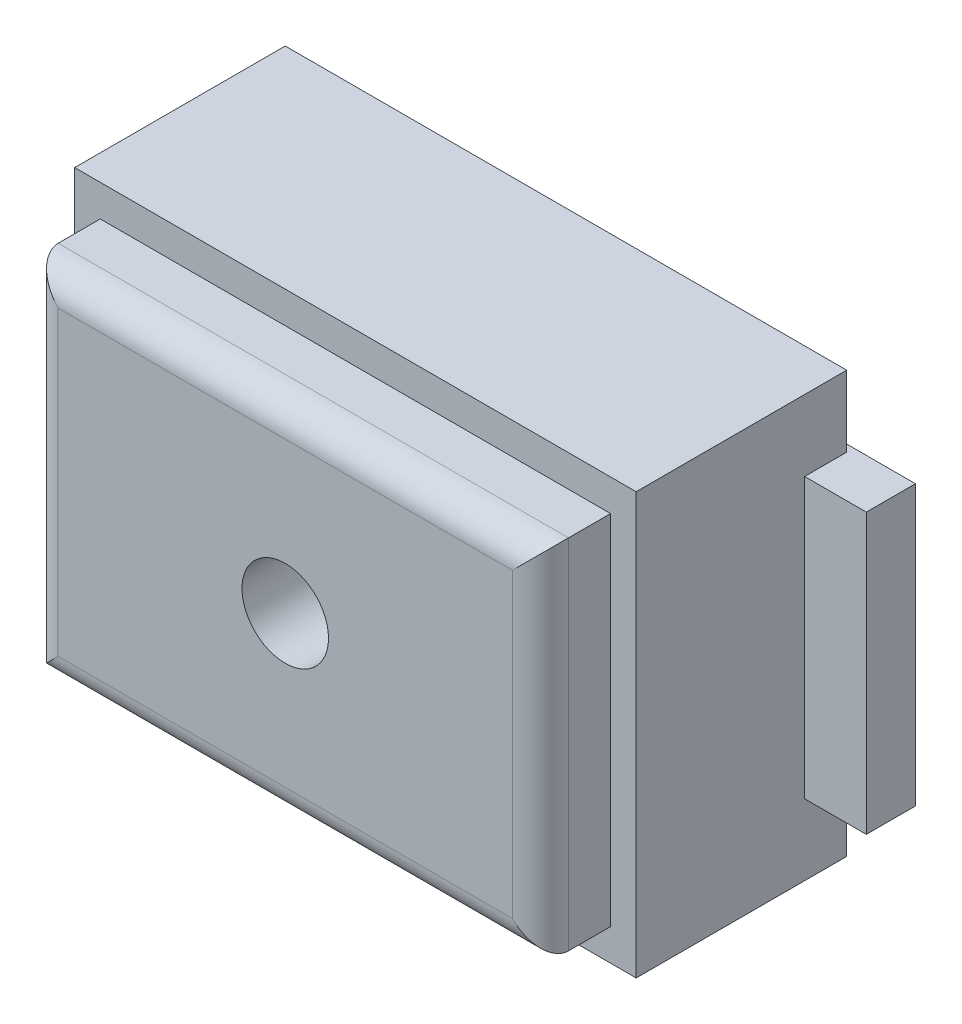
ISO-10303-21;
HEADER;
FILE_DESCRIPTION(('STEP AP214'),'2;1');
FILE_NAME('part.step','',(''),(''),'','','');
FILE_SCHEMA(('AUTOMOTIVE_DESIGN { 1 0 10303 214 1 1 1 1 }'));
ENDSEC;
DATA;
#1=APPLICATION_CONTEXT('core data for automotive mechanical design processes');
#2=APPLICATION_PROTOCOL_DEFINITION('international standard','automotive_design',2000,#1);
#3=PRODUCT_CONTEXT('',#1,'mechanical');
#4=PRODUCT('Part','Part','',(#3));
#5=PRODUCT_RELATED_PRODUCT_CATEGORY('part','',(#4));
#6=PRODUCT_DEFINITION_FORMATION('','',#4);
#7=PRODUCT_DEFINITION_CONTEXT('part definition',#1,'design');
#8=PRODUCT_DEFINITION('design','',#6,#7);
#9=PRODUCT_DEFINITION_SHAPE('','',#8);
#10=(LENGTH_UNIT() NAMED_UNIT(*) SI_UNIT(.MILLI.,.METRE.));
#11=(NAMED_UNIT(*) PLANE_ANGLE_UNIT() SI_UNIT($,.RADIAN.));
#12=(NAMED_UNIT(*) SI_UNIT($,.STERADIAN.) SOLID_ANGLE_UNIT());
#13=UNCERTAINTY_MEASURE_WITH_UNIT(LENGTH_MEASURE(1.E-05),#10,'distance_accuracy_value','');
#14=(GEOMETRIC_REPRESENTATION_CONTEXT(3) GLOBAL_UNCERTAINTY_ASSIGNED_CONTEXT((#13)) GLOBAL_UNIT_ASSIGNED_CONTEXT((#10,
#11,#12)) REPRESENTATION_CONTEXT('',''));
#15=CARTESIAN_POINT('',(0.,0.,0.));
#16=DIRECTION('',(0.,0.,1.));
#17=DIRECTION('',(1.,0.,0.));
#18=AXIS2_PLACEMENT_3D('',#15,#16,#17);
#19=CARTESIAN_POINT('',(0.,0.,1.5));
#20=DIRECTION('',(0.,0.,-1.));
#21=DIRECTION('',(-1.,0.,0.));
#22=AXIS2_PLACEMENT_3D('',#19,#20,#21);
#23=PLANE('',#22);
#24=CARTESIAN_POINT('',(0.,0.,1.5));
#25=DIRECTION('',(0.,0.,1.));
#26=DIRECTION('',(1.,0.,0.));
#27=AXIS2_PLACEMENT_3D('',#24,#25,#26);
#28=CIRCLE('',#27,0.308254007567541);
#29=CARTESIAN_POINT('',(0.308254007567541,0.,1.5));
#30=VERTEX_POINT('',#29);
#31=EDGE_CURVE('E20',#30,#30,#28,.T.);
#32=ORIENTED_EDGE('',*,*,#31,.T.);
#33=EDGE_LOOP('',(#32));
#34=FACE_BOUND('',#33,.T.);
#35=ADVANCED_FACE('F17',(#34),#23,.F.);
#36=CARTESIAN_POINT('',(0.,0.,1.5));
#37=DIRECTION('',(0.,0.,1.));
#38=DIRECTION('',(1.,0.,0.));
#39=AXIS2_PLACEMENT_3D('',#36,#37,#38);
#40=CYLINDRICAL_SURFACE('',#39,0.308254007567541);
#41=CARTESIAN_POINT('',(0.,0.,2.));
#42=DIRECTION('',(0.,0.,1.));
#43=DIRECTION('',(1.,0.,0.));
#44=AXIS2_PLACEMENT_3D('',#41,#42,#43);
#45=CIRCLE('',#44,0.308254007567541);
#46=CARTESIAN_POINT('',(0.308254007567541,0.,2.));
#47=VERTEX_POINT('',#46);
#48=EDGE_CURVE('E223',#47,#47,#45,.T.);
#49=ORIENTED_EDGE('',*,*,#48,.T.);
#50=EDGE_LOOP('',(#49));
#51=FACE_BOUND('',#50,.T.);
#52=ORIENTED_EDGE('',*,*,#31,.F.);
#53=EDGE_LOOP('',(#52));
#54=FACE_BOUND('',#53,.T.);
#55=ADVANCED_FACE('F239',(#51,#54),#40,.F.);
#56=CARTESIAN_POINT('',(0.,0.,2.));
#57=DIRECTION('',(0.,0.,-1.));
#58=DIRECTION('',(-1.,0.,0.));
#59=AXIS2_PLACEMENT_3D('',#56,#57,#58);
#60=PLANE('',#59);
#61=DIRECTION('',(0.,1.,0.));
#62=VECTOR('',#61,1.);
#63=CARTESIAN_POINT('',(1.6176505170228,0.,2.));
#64=LINE('',#63,#62);
#65=CARTESIAN_POINT('',(1.6176505170228,1.07419757527779,2.));
#66=VERTEX_POINT('',#65);
#67=CARTESIAN_POINT('',(1.6176505170228,-1.07419757527779,2.));
#68=VERTEX_POINT('',#67);
#69=EDGE_CURVE('E188',#66,#68,#64,.F.);
#70=ORIENTED_EDGE('',*,*,#69,.F.);
#71=DIRECTION('',(-1.,0.,0.));
#72=VECTOR('',#71,1.);
#73=CARTESIAN_POINT('',(0.,1.07419757527779,2.));
#74=LINE('',#73,#72);
#75=CARTESIAN_POINT('',(-1.6176505170228,1.07419757527779,2.));
#76=VERTEX_POINT('',#75);
#77=EDGE_CURVE('E227',#76,#66,#74,.F.);
#78=ORIENTED_EDGE('',*,*,#77,.F.);
#79=DIRECTION('',(0.,-1.,0.));
#80=VECTOR('',#79,1.);
#81=CARTESIAN_POINT('',(-1.6176505170228,0.,2.));
#82=LINE('',#81,#80);
#83=CARTESIAN_POINT('',(-1.6176505170228,-1.07419757527779,2.));
#84=VERTEX_POINT('',#83);
#85=EDGE_CURVE('E231',#84,#76,#82,.F.);
#86=ORIENTED_EDGE('',*,*,#85,.F.);
#87=DIRECTION('',(1.,0.,0.));
#88=VECTOR('',#87,1.);
#89=CARTESIAN_POINT('',(0.,-1.07419757527779,2.));
#90=LINE('',#89,#88);
#91=EDGE_CURVE('E191',#68,#84,#90,.F.);
#92=ORIENTED_EDGE('',*,*,#91,.F.);
#93=EDGE_LOOP('',(#70,#78,#86,#92));
#94=FACE_BOUND('',#93,.T.);
#95=ORIENTED_EDGE('',*,*,#48,.F.);
#96=EDGE_LOOP('',(#95));
#97=FACE_BOUND('',#96,.T.);
#98=ADVANCED_FACE('F241',(#94,#97),#60,.F.);
#99=CARTESIAN_POINT('',(0.,0.,0.3));
#100=DIRECTION('',(0.,0.,-1.));
#101=DIRECTION('',(-1.,0.,0.));
#102=AXIS2_PLACEMENT_3D('',#99,#100,#101);
#103=PLANE('',#102);
#104=DIRECTION('',(0.,1.,0.));
#105=VECTOR('',#104,1.);
#106=CARTESIAN_POINT('',(1.99999999999999,-1.5,0.3));
#107=LINE('',#106,#105);
#108=CARTESIAN_POINT('',(1.99999999999999,0.994216860429553,0.3));
#109=VERTEX_POINT('',#108);
#110=CARTESIAN_POINT('',(1.99999999999999,-0.99421686042956,0.3));
#111=VERTEX_POINT('',#110);
#112=EDGE_CURVE('E350',#109,#111,#107,.F.);
#113=ORIENTED_EDGE('',*,*,#112,.T.);
#114=DIRECTION('',(-1.,0.,0.));
#115=VECTOR('',#114,1.);
#116=CARTESIAN_POINT('',(0.,-0.99421686042956,0.3));
#117=LINE('',#116,#115);
#118=CARTESIAN_POINT('',(2.43957096548719,-0.99421686042956,0.3));
#119=VERTEX_POINT('',#118);
#120=EDGE_CURVE('E221',#119,#111,#117,.T.);
#121=ORIENTED_EDGE('',*,*,#120,.F.);
#122=DIRECTION('',(0.,1.,0.));
#123=VECTOR('',#122,1.);
#124=CARTESIAN_POINT('',(2.43957096548719,-0.99421686042956,0.3));
#125=LINE('',#124,#123);
#126=CARTESIAN_POINT('',(2.43957096548719,0.994216860429553,0.3));
#127=VERTEX_POINT('',#126);
#128=EDGE_CURVE('E393',#127,#119,#125,.F.);
#129=ORIENTED_EDGE('',*,*,#128,.F.);
#130=DIRECTION('',(-1.,0.,0.));
#131=VECTOR('',#130,1.);
#132=CARTESIAN_POINT('',(0.,0.994216860429553,0.3));
#133=LINE('',#132,#131);
#134=EDGE_CURVE('E218',#109,#127,#133,.F.);
#135=ORIENTED_EDGE('',*,*,#134,.F.);
#136=EDGE_LOOP('',(#113,#121,#129,#135));
#137=FACE_BOUND('',#136,.T.);
#138=ADVANCED_FACE('F247',(#137),#103,.F.);
#139=CARTESIAN_POINT('',(1.6176505170228,0.,1.8));
#140=DIRECTION('',(0.,1.,0.));
#141=DIRECTION('',(0.,0.,1.));
#142=AXIS2_PLACEMENT_3D('',#139,#140,#141);
#143=CYLINDRICAL_SURFACE('',#142,0.2);
#144=CARTESIAN_POINT('',(1.6176505170228,-1.07419757527779,1.8));
#145=DIRECTION('',(0.707106781186547,0.707106781186547,0.));
#146=DIRECTION('',(0.707106781186547,-0.707106781186547,0.));
#147=AXIS2_PLACEMENT_3D('',#144,#145,#146);
#148=ELLIPSE('',#147,0.282842712474619,0.2);
#149=CARTESIAN_POINT('',(1.8176505170228,-1.27419757527779,1.8));
#150=VERTEX_POINT('',#149);
#151=EDGE_CURVE('E185',#150,#68,#148,.F.);
#152=ORIENTED_EDGE('',*,*,#151,.F.);
#153=DIRECTION('',(0.,1.,0.));
#154=VECTOR('',#153,1.);
#155=CARTESIAN_POINT('',(1.8176505170228,0.,1.8));
#156=LINE('',#155,#154);
#157=CARTESIAN_POINT('',(1.8176505170228,1.27419757527779,1.8));
#158=VERTEX_POINT('',#157);
#159=EDGE_CURVE('E163',#158,#150,#156,.F.);
#160=ORIENTED_EDGE('',*,*,#159,.F.);
#161=CARTESIAN_POINT('',(1.6176505170228,1.07419757527779,1.8));
#162=DIRECTION('',(-0.707106781186547,0.707106781186547,0.));
#163=DIRECTION('',(-0.707106781186547,-0.707106781186547,0.));
#164=AXIS2_PLACEMENT_3D('',#161,#162,#163);
#165=ELLIPSE('',#164,0.282842712474619,0.2);
#166=EDGE_CURVE('E224',#66,#158,#165,.T.);
#167=ORIENTED_EDGE('',*,*,#166,.F.);
#168=ORIENTED_EDGE('',*,*,#69,.T.);
#169=EDGE_LOOP('',(#152,#160,#167,#168));
#170=FACE_BOUND('',#169,.T.);
#171=ADVANCED_FACE('F186',(#170),#143,.T.);
#172=CARTESIAN_POINT('',(0.,-1.07419757527779,1.8));
#173=DIRECTION('',(1.,0.,0.));
#174=DIRECTION('',(0.,0.,-1.));
#175=AXIS2_PLACEMENT_3D('',#172,#173,#174);
#176=CYLINDRICAL_SURFACE('',#175,0.2);
#177=ORIENTED_EDGE('',*,*,#151,.T.);
#178=ORIENTED_EDGE('',*,*,#91,.T.);
#179=CARTESIAN_POINT('',(-1.6176505170228,-1.07419757527779,1.8));
#180=DIRECTION('',(0.707106781186547,-0.707106781186547,0.));
#181=DIRECTION('',(-0.707106781186547,-0.707106781186547,0.));
#182=AXIS2_PLACEMENT_3D('',#179,#180,#181);
#183=ELLIPSE('',#182,0.282842712474619,0.2);
#184=CARTESIAN_POINT('',(-1.8176505170228,-1.27419757527779,1.8));
#185=VERTEX_POINT('',#184);
#186=EDGE_CURVE('E196',#185,#84,#183,.F.);
#187=ORIENTED_EDGE('',*,*,#186,.F.);
#188=DIRECTION('',(1.,0.,0.));
#189=VECTOR('',#188,1.);
#190=CARTESIAN_POINT('',(0.,-1.27419757527779,1.8));
#191=LINE('',#190,#189);
#192=EDGE_CURVE('E179',#150,#185,#191,.F.);
#193=ORIENTED_EDGE('',*,*,#192,.F.);
#194=EDGE_LOOP('',(#177,#178,#187,#193));
#195=FACE_BOUND('',#194,.T.);
#196=ADVANCED_FACE('F194',(#195),#176,.T.);
#197=CARTESIAN_POINT('',(-1.6176505170228,0.,1.8));
#198=DIRECTION('',(0.,-1.,0.));
#199=DIRECTION('',(0.,0.,-1.));
#200=AXIS2_PLACEMENT_3D('',#197,#198,#199);
#201=CYLINDRICAL_SURFACE('',#200,0.2);
#202=CARTESIAN_POINT('',(-1.6176505170228,1.07419757527779,1.8));
#203=DIRECTION('',(-0.707106781186547,-0.707106781186547,0.));
#204=DIRECTION('',(-0.707106781186547,0.707106781186547,0.));
#205=AXIS2_PLACEMENT_3D('',#202,#203,#204);
#206=ELLIPSE('',#205,0.282842712474619,0.2);
#207=CARTESIAN_POINT('',(-1.8176505170228,1.27419757527779,1.8));
#208=VERTEX_POINT('',#207);
#209=EDGE_CURVE('E228',#208,#76,#206,.F.);
#210=ORIENTED_EDGE('',*,*,#209,.F.);
#211=DIRECTION('',(0.,1.,0.));
#212=VECTOR('',#211,1.);
#213=CARTESIAN_POINT('',(-1.8176505170228,0.,1.8));
#214=LINE('',#213,#212);
#215=EDGE_CURVE('E200',#185,#208,#214,.T.);
#216=ORIENTED_EDGE('',*,*,#215,.F.);
#217=ORIENTED_EDGE('',*,*,#186,.T.);
#218=ORIENTED_EDGE('',*,*,#85,.T.);
#219=EDGE_LOOP('',(#210,#216,#217,#218));
#220=FACE_BOUND('',#219,.T.);
#221=ADVANCED_FACE('F335',(#220),#201,.T.);
#222=CARTESIAN_POINT('',(0.,1.07419757527779,1.8));
#223=DIRECTION('',(-1.,0.,0.));
#224=DIRECTION('',(0.,0.,1.));
#225=AXIS2_PLACEMENT_3D('',#222,#223,#224);
#226=CYLINDRICAL_SURFACE('',#225,0.2);
#227=ORIENTED_EDGE('',*,*,#166,.T.);
#228=DIRECTION('',(1.,0.,0.));
#229=VECTOR('',#228,1.);
#230=CARTESIAN_POINT('',(0.,1.27419757527779,1.8));
#231=LINE('',#230,#229);
#232=EDGE_CURVE('E406',#208,#158,#231,.T.);
#233=ORIENTED_EDGE('',*,*,#232,.F.);
#234=ORIENTED_EDGE('',*,*,#209,.T.);
#235=ORIENTED_EDGE('',*,*,#77,.T.);
#236=EDGE_LOOP('',(#227,#233,#234,#235));
#237=FACE_BOUND('',#236,.T.);
#238=ADVANCED_FACE('F331',(#237),#226,.T.);
#239=CARTESIAN_POINT('',(0.,0.,0.3));
#240=DIRECTION('',(0.,0.,-1.));
#241=DIRECTION('',(-1.,0.,0.));
#242=AXIS2_PLACEMENT_3D('',#239,#240,#241);
#243=PLANE('',#242);
#244=DIRECTION('',(0.,1.,0.));
#245=VECTOR('',#244,1.);
#246=CARTESIAN_POINT('',(-2.00000000000002,-1.50000000000001,0.3));
#247=LINE('',#246,#245);
#248=CARTESIAN_POINT('',(-2.00000000000002,-0.99421686042956,0.3));
#249=VERTEX_POINT('',#248);
#250=CARTESIAN_POINT('',(-2.00000000000002,0.994216860429553,0.3));
#251=VERTEX_POINT('',#250);
#252=EDGE_CURVE('E371',#249,#251,#247,.T.);
#253=ORIENTED_EDGE('',*,*,#252,.T.);
#254=DIRECTION('',(-1.,0.,0.));
#255=VECTOR('',#254,1.);
#256=CARTESIAN_POINT('',(0.,0.994216860429553,0.3));
#257=LINE('',#256,#255);
#258=CARTESIAN_POINT('',(-2.45059161204089,0.994216860429553,0.3));
#259=VERTEX_POINT('',#258);
#260=EDGE_CURVE('E226',#259,#251,#257,.F.);
#261=ORIENTED_EDGE('',*,*,#260,.F.);
#262=DIRECTION('',(0.,1.,0.));
#263=VECTOR('',#262,1.);
#264=CARTESIAN_POINT('',(-2.45059161204089,-0.99421686042956,0.3));
#265=LINE('',#264,#263);
#266=CARTESIAN_POINT('',(-2.45059161204089,-0.99421686042956,0.3));
#267=VERTEX_POINT('',#266);
#268=EDGE_CURVE('E475',#267,#259,#265,.T.);
#269=ORIENTED_EDGE('',*,*,#268,.F.);
#270=DIRECTION('',(-1.,0.,0.));
#271=VECTOR('',#270,1.);
#272=CARTESIAN_POINT('',(0.,-0.99421686042956,0.3));
#273=LINE('',#272,#271);
#274=EDGE_CURVE('E397',#249,#267,#273,.T.);
#275=ORIENTED_EDGE('',*,*,#274,.F.);
#276=EDGE_LOOP('',(#253,#261,#269,#275));
#277=FACE_BOUND('',#276,.T.);
#278=ADVANCED_FACE('F327',(#277),#243,.F.);
#279=CARTESIAN_POINT('',(2.43957096548719,-0.99421686042956,-0.05));
#280=DIRECTION('',(1.,0.,0.));
#281=DIRECTION('',(0.,0.,-1.));
#282=AXIS2_PLACEMENT_3D('',#279,#280,#281);
#283=PLANE('',#282);
#284=DIRECTION('',(0.,0.,-1.));
#285=VECTOR('',#284,1.);
#286=CARTESIAN_POINT('',(2.43957096548719,-0.99421686042956,-0.05));
#287=LINE('',#286,#285);
#288=CARTESIAN_POINT('',(2.43957096548719,-0.99421686042956,-0.05));
#289=VERTEX_POINT('',#288);
#290=EDGE_CURVE('E391',#119,#289,#287,.T.);
#291=ORIENTED_EDGE('',*,*,#290,.T.);
#292=DIRECTION('',(0.,1.,0.));
#293=VECTOR('',#292,1.);
#294=CARTESIAN_POINT('',(2.43957096548719,0.,-0.05));
#295=LINE('',#294,#293);
#296=CARTESIAN_POINT('',(2.43957096548719,0.994216860429553,-0.05));
#297=VERTEX_POINT('',#296);
#298=EDGE_CURVE('E470',#297,#289,#295,.F.);
#299=ORIENTED_EDGE('',*,*,#298,.F.);
#300=DIRECTION('',(0.,0.,-1.));
#301=VECTOR('',#300,1.);
#302=CARTESIAN_POINT('',(2.43957096548719,0.994216860429553,-0.05));
#303=LINE('',#302,#301);
#304=EDGE_CURVE('E395',#297,#127,#303,.F.);
#305=ORIENTED_EDGE('',*,*,#304,.T.);
#306=ORIENTED_EDGE('',*,*,#128,.T.);
#307=EDGE_LOOP('',(#291,#299,#305,#306));
#308=FACE_BOUND('',#307,.T.);
#309=ADVANCED_FACE('F323',(#308),#283,.T.);
#310=CARTESIAN_POINT('',(-2.00000000000002,-1.50000000000001,1.5));
#311=DIRECTION('',(1.,0.,0.));
#312=DIRECTION('',(0.,0.,-1.));
#313=AXIS2_PLACEMENT_3D('',#310,#311,#312);
#314=PLANE('',#313);
#315=DIRECTION('',(0.,0.,-1.));
#316=VECTOR('',#315,1.);
#317=CARTESIAN_POINT('',(-2.00000000000002,-0.99421686042956,1.5));
#318=LINE('',#317,#316);
#319=CARTESIAN_POINT('',(-2.00000000000002,-0.99421686042956,0.));
#320=VERTEX_POINT('',#319);
#321=EDGE_CURVE('E374',#320,#249,#318,.F.);
#322=ORIENTED_EDGE('',*,*,#321,.F.);
#323=DIRECTION('',(0.,1.,0.));
#324=VECTOR('',#323,1.);
#325=CARTESIAN_POINT('',(-2.00000000000002,-1.50000000000001,0.));
#326=LINE('',#325,#324);
#327=CARTESIAN_POINT('',(-2.00000000000002,-1.50000000000001,0.));
#328=VERTEX_POINT('',#327);
#329=EDGE_CURVE('E377',#328,#320,#326,.T.);
#330=ORIENTED_EDGE('',*,*,#329,.F.);
#331=DIRECTION('',(0.,0.,-1.));
#332=VECTOR('',#331,1.);
#333=CARTESIAN_POINT('',(-2.00000000000002,-1.50000000000001,1.5));
#334=LINE('',#333,#332);
#335=CARTESIAN_POINT('',(-2.00000000000002,-1.50000000000001,1.5));
#336=VERTEX_POINT('',#335);
#337=EDGE_CURVE('E380',#336,#328,#334,.T.);
#338=ORIENTED_EDGE('',*,*,#337,.F.);
#339=DIRECTION('',(0.,1.,0.));
#340=VECTOR('',#339,1.);
#341=CARTESIAN_POINT('',(-2.00000000000002,0.,1.5));
#342=LINE('',#341,#340);
#343=CARTESIAN_POINT('',(-2.00000000000002,1.5,1.5));
#344=VERTEX_POINT('',#343);
#345=EDGE_CURVE('E441',#344,#336,#342,.F.);
#346=ORIENTED_EDGE('',*,*,#345,.F.);
#347=DIRECTION('',(0.,0.,-1.));
#348=VECTOR('',#347,1.);
#349=CARTESIAN_POINT('',(-2.00000000000002,1.5,1.5));
#350=LINE('',#349,#348);
#351=CARTESIAN_POINT('',(-2.00000000000002,1.5,0.));
#352=VERTEX_POINT('',#351);
#353=EDGE_CURVE('E383',#352,#344,#350,.F.);
#354=ORIENTED_EDGE('',*,*,#353,.F.);
#355=DIRECTION('',(0.,1.,0.));
#356=VECTOR('',#355,1.);
#357=CARTESIAN_POINT('',(-2.00000000000002,-1.50000000000001,0.));
#358=LINE('',#357,#356);
#359=CARTESIAN_POINT('',(-2.00000000000002,0.994216860429553,0.));
#360=VERTEX_POINT('',#359);
#361=EDGE_CURVE('E385',#360,#352,#358,.T.);
#362=ORIENTED_EDGE('',*,*,#361,.F.);
#363=DIRECTION('',(0.,0.,-1.));
#364=VECTOR('',#363,1.);
#365=CARTESIAN_POINT('',(-2.00000000000002,0.994216860429553,1.5));
#366=LINE('',#365,#364);
#367=EDGE_CURVE('E388',#251,#360,#366,.T.);
#368=ORIENTED_EDGE('',*,*,#367,.F.);
#369=ORIENTED_EDGE('',*,*,#252,.F.);
#370=EDGE_LOOP('',(#322,#330,#338,#346,#354,#362,#368,#369));
#371=FACE_BOUND('',#370,.T.);
#372=ADVANCED_FACE('F319',(#371),#314,.F.);
#373=CARTESIAN_POINT('',(1.99999999999999,-1.5,1.5));
#374=DIRECTION('',(-1.,0.,0.));
#375=DIRECTION('',(0.,0.,1.));
#376=AXIS2_PLACEMENT_3D('',#373,#374,#375);
#377=PLANE('',#376);
#378=DIRECTION('',(0.,0.,1.));
#379=VECTOR('',#378,1.);
#380=CARTESIAN_POINT('',(1.99999999999999,-0.99421686042956,1.5));
#381=LINE('',#380,#379);
#382=CARTESIAN_POINT('',(1.99999999999999,-0.99421686042956,0.));
#383=VERTEX_POINT('',#382);
#384=EDGE_CURVE('E355',#111,#383,#381,.F.);
#385=ORIENTED_EDGE('',*,*,#384,.F.);
#386=ORIENTED_EDGE('',*,*,#112,.F.);
#387=DIRECTION('',(0.,0.,1.));
#388=VECTOR('',#387,1.);
#389=CARTESIAN_POINT('',(1.99999999999999,0.994216860429553,1.5));
#390=LINE('',#389,#388);
#391=CARTESIAN_POINT('',(1.99999999999999,0.994216860429553,0.));
#392=VERTEX_POINT('',#391);
#393=EDGE_CURVE('E356',#392,#109,#390,.T.);
#394=ORIENTED_EDGE('',*,*,#393,.F.);
#395=DIRECTION('',(0.,1.,0.));
#396=VECTOR('',#395,1.);
#397=CARTESIAN_POINT('',(1.99999999999999,-1.5,0.));
#398=LINE('',#397,#396);
#399=CARTESIAN_POINT('',(1.99999999999999,1.5,0.));
#400=VERTEX_POINT('',#399);
#401=EDGE_CURVE('E360',#400,#392,#398,.F.);
#402=ORIENTED_EDGE('',*,*,#401,.F.);
#403=DIRECTION('',(0.,0.,1.));
#404=VECTOR('',#403,1.);
#405=CARTESIAN_POINT('',(1.99999999999999,1.5,1.5));
#406=LINE('',#405,#404);
#407=CARTESIAN_POINT('',(1.99999999999999,1.5,1.5));
#408=VERTEX_POINT('',#407);
#409=EDGE_CURVE('E366',#408,#400,#406,.F.);
#410=ORIENTED_EDGE('',*,*,#409,.F.);
#411=DIRECTION('',(0.,1.,0.));
#412=VECTOR('',#411,1.);
#413=CARTESIAN_POINT('',(1.99999999999999,0.,1.5));
#414=LINE('',#413,#412);
#415=CARTESIAN_POINT('',(1.99999999999999,-1.5,1.5));
#416=VERTEX_POINT('',#415);
#417=EDGE_CURVE('E214',#416,#408,#414,.T.);
#418=ORIENTED_EDGE('',*,*,#417,.F.);
#419=DIRECTION('',(0.,0.,1.));
#420=VECTOR('',#419,1.);
#421=CARTESIAN_POINT('',(1.99999999999999,-1.5,1.5));
#422=LINE('',#421,#420);
#423=CARTESIAN_POINT('',(1.99999999999999,-1.5,0.));
#424=VERTEX_POINT('',#423);
#425=EDGE_CURVE('E369',#424,#416,#422,.T.);
#426=ORIENTED_EDGE('',*,*,#425,.F.);
#427=DIRECTION('',(0.,1.,0.));
#428=VECTOR('',#427,1.);
#429=CARTESIAN_POINT('',(1.99999999999999,-1.5,0.));
#430=LINE('',#429,#428);
#431=EDGE_CURVE('E173',#383,#424,#430,.F.);
#432=ORIENTED_EDGE('',*,*,#431,.F.);
#433=EDGE_LOOP('',(#385,#386,#394,#402,#410,#418,#426,#432));
#434=FACE_BOUND('',#433,.T.);
#435=ADVANCED_FACE('F316',(#434),#377,.F.);
#436=CARTESIAN_POINT('',(1.8176505170228,0.,2.));
#437=DIRECTION('',(1.,0.,0.));
#438=DIRECTION('',(0.,0.,-1.));
#439=AXIS2_PLACEMENT_3D('',#436,#437,#438);
#440=PLANE('',#439);
#441=DIRECTION('',(0.,0.,-1.));
#442=VECTOR('',#441,1.);
#443=CARTESIAN_POINT('',(1.8176505170228,-1.27419757527779,2.));
#444=LINE('',#443,#442);
#445=CARTESIAN_POINT('',(1.8176505170228,-1.27419757527779,1.5));
#446=VERTEX_POINT('',#445);
#447=EDGE_CURVE('E167',#446,#150,#444,.F.);
#448=ORIENTED_EDGE('',*,*,#447,.F.);
#449=DIRECTION('',(0.,1.,0.));
#450=VECTOR('',#449,1.);
#451=CARTESIAN_POINT('',(1.8176505170228,0.,1.5));
#452=LINE('',#451,#450);
#453=CARTESIAN_POINT('',(1.8176505170228,1.27419757527779,1.5));
#454=VERTEX_POINT('',#453);
#455=EDGE_CURVE('E207',#454,#446,#452,.F.);
#456=ORIENTED_EDGE('',*,*,#455,.F.);
#457=DIRECTION('',(0.,0.,1.));
#458=VECTOR('',#457,1.);
#459=CARTESIAN_POINT('',(1.8176505170228,1.27419757527779,2.));
#460=LINE('',#459,#458);
#461=EDGE_CURVE('E169',#158,#454,#460,.F.);
#462=ORIENTED_EDGE('',*,*,#461,.F.);
#463=ORIENTED_EDGE('',*,*,#159,.T.);
#464=EDGE_LOOP('',(#448,#456,#462,#463));
#465=FACE_BOUND('',#464,.T.);
#466=ADVANCED_FACE('F165',(#465),#440,.T.);
#467=CARTESIAN_POINT('',(0.,-1.27419757527779,2.));
#468=DIRECTION('',(0.,-1.,0.));
#469=DIRECTION('',(0.,0.,-1.));
#470=AXIS2_PLACEMENT_3D('',#467,#468,#469);
#471=PLANE('',#470);
#472=DIRECTION('',(0.,0.,1.));
#473=VECTOR('',#472,1.);
#474=CARTESIAN_POINT('',(-1.8176505170228,-1.27419757527779,2.));
#475=LINE('',#474,#473);
#476=CARTESIAN_POINT('',(-1.8176505170228,-1.27419757527779,1.5));
#477=VERTEX_POINT('',#476);
#478=EDGE_CURVE('E198',#477,#185,#475,.T.);
#479=ORIENTED_EDGE('',*,*,#478,.F.);
#480=DIRECTION('',(1.,0.,0.));
#481=VECTOR('',#480,1.);
#482=CARTESIAN_POINT('',(0.,-1.27419757527779,1.5));
#483=LINE('',#482,#481);
#484=EDGE_CURVE('E181',#446,#477,#483,.F.);
#485=ORIENTED_EDGE('',*,*,#484,.F.);
#486=ORIENTED_EDGE('',*,*,#447,.T.);
#487=ORIENTED_EDGE('',*,*,#192,.T.);
#488=EDGE_LOOP('',(#479,#485,#486,#487));
#489=FACE_BOUND('',#488,.T.);
#490=ADVANCED_FACE('F177',(#489),#471,.T.);
#491=CARTESIAN_POINT('',(-1.8176505170228,0.,2.));
#492=DIRECTION('',(-1.,0.,0.));
#493=DIRECTION('',(0.,0.,1.));
#494=AXIS2_PLACEMENT_3D('',#491,#492,#493);
#495=PLANE('',#494);
#496=DIRECTION('',(0.,0.,1.));
#497=VECTOR('',#496,1.);
#498=CARTESIAN_POINT('',(-1.8176505170228,1.27419757527779,2.));
#499=LINE('',#498,#497);
#500=CARTESIAN_POINT('',(-1.8176505170228,1.27419757527779,1.5));
#501=VERTEX_POINT('',#500);
#502=EDGE_CURVE('E403',#501,#208,#499,.T.);
#503=ORIENTED_EDGE('',*,*,#502,.F.);
#504=DIRECTION('',(0.,1.,0.));
#505=VECTOR('',#504,1.);
#506=CARTESIAN_POINT('',(-1.8176505170228,0.,1.5));
#507=LINE('',#506,#505);
#508=EDGE_CURVE('E206',#477,#501,#507,.T.);
#509=ORIENTED_EDGE('',*,*,#508,.F.);
#510=ORIENTED_EDGE('',*,*,#478,.T.);
#511=ORIENTED_EDGE('',*,*,#215,.T.);
#512=EDGE_LOOP('',(#503,#509,#510,#511));
#513=FACE_BOUND('',#512,.T.);
#514=ADVANCED_FACE('F307',(#513),#495,.T.);
#515=CARTESIAN_POINT('',(0.,1.27419757527779,2.));
#516=DIRECTION('',(0.,1.,0.));
#517=DIRECTION('',(0.,0.,1.));
#518=AXIS2_PLACEMENT_3D('',#515,#516,#517);
#519=PLANE('',#518);
#520=ORIENTED_EDGE('',*,*,#461,.T.);
#521=DIRECTION('',(1.,0.,0.));
#522=VECTOR('',#521,1.);
#523=CARTESIAN_POINT('',(0.,1.27419757527779,1.5));
#524=LINE('',#523,#522);
#525=EDGE_CURVE('E415',#501,#454,#524,.T.);
#526=ORIENTED_EDGE('',*,*,#525,.F.);
#527=ORIENTED_EDGE('',*,*,#502,.T.);
#528=ORIENTED_EDGE('',*,*,#232,.T.);
#529=EDGE_LOOP('',(#520,#526,#527,#528));
#530=FACE_BOUND('',#529,.T.);
#531=ADVANCED_FACE('F303',(#530),#519,.T.);
#532=CARTESIAN_POINT('',(-2.45059161204089,-0.99421686042956,-0.05));
#533=DIRECTION('',(-1.,0.,0.));
#534=DIRECTION('',(0.,0.,1.));
#535=AXIS2_PLACEMENT_3D('',#532,#533,#534);
#536=PLANE('',#535);
#537=DIRECTION('',(0.,0.,1.));
#538=VECTOR('',#537,1.);
#539=CARTESIAN_POINT('',(-2.45059161204089,0.994216860429553,-0.05));
#540=LINE('',#539,#538);
#541=CARTESIAN_POINT('',(-2.45059161204089,0.994216860429553,-0.05));
#542=VERTEX_POINT('',#541);
#543=EDGE_CURVE('E473',#259,#542,#540,.F.);
#544=ORIENTED_EDGE('',*,*,#543,.T.);
#545=DIRECTION('',(0.,1.,0.));
#546=VECTOR('',#545,1.);
#547=CARTESIAN_POINT('',(-2.45059161204089,0.,-0.05));
#548=LINE('',#547,#546);
#549=CARTESIAN_POINT('',(-2.45059161204089,-0.99421686042956,-0.05));
#550=VERTEX_POINT('',#549);
#551=EDGE_CURVE('E462',#550,#542,#548,.T.);
#552=ORIENTED_EDGE('',*,*,#551,.F.);
#553=DIRECTION('',(0.,0.,1.));
#554=VECTOR('',#553,1.);
#555=CARTESIAN_POINT('',(-2.45059161204089,-0.99421686042956,-0.05));
#556=LINE('',#555,#554);
#557=EDGE_CURVE('E412',#550,#267,#556,.T.);
#558=ORIENTED_EDGE('',*,*,#557,.T.);
#559=ORIENTED_EDGE('',*,*,#268,.T.);
#560=EDGE_LOOP('',(#544,#552,#558,#559));
#561=FACE_BOUND('',#560,.T.);
#562=ADVANCED_FACE('F299',(#561),#536,.T.);
#563=CARTESIAN_POINT('',(0.,0.,-0.05));
#564=DIRECTION('',(0.,0.,-1.));
#565=DIRECTION('',(-1.,0.,0.));
#566=AXIS2_PLACEMENT_3D('',#563,#564,#565);
#567=PLANE('',#566);
#568=DIRECTION('',(0.,1.,0.));
#569=VECTOR('',#568,1.);
#570=CARTESIAN_POINT('',(1.56042903451278,-0.99421686042956,-0.05));
#571=LINE('',#570,#569);
#572=CARTESIAN_POINT('',(1.56042903451278,0.994216860429553,-0.05));
#573=VERTEX_POINT('',#572);
#574=CARTESIAN_POINT('',(1.56042903451278,-0.99421686042956,-0.05));
#575=VERTEX_POINT('',#574);
#576=EDGE_CURVE('E456',#573,#575,#571,.F.);
#577=ORIENTED_EDGE('',*,*,#576,.F.);
#578=DIRECTION('',(-1.,0.,0.));
#579=VECTOR('',#578,1.);
#580=CARTESIAN_POINT('',(0.,0.994216860429553,-0.05));
#581=LINE('',#580,#579);
#582=EDGE_CURVE('E467',#573,#297,#581,.F.);
#583=ORIENTED_EDGE('',*,*,#582,.T.);
#584=ORIENTED_EDGE('',*,*,#298,.T.);
#585=DIRECTION('',(1.,0.,0.));
#586=VECTOR('',#585,1.);
#587=CARTESIAN_POINT('',(1.56042903451278,-0.99421686042956,-0.05));
#588=LINE('',#587,#586);
#589=EDGE_CURVE('E458',#575,#289,#588,.T.);
#590=ORIENTED_EDGE('',*,*,#589,.F.);
#591=EDGE_LOOP('',(#577,#583,#584,#590));
#592=FACE_BOUND('',#591,.T.);
#593=ADVANCED_FACE('F295',(#592),#567,.T.);
#594=CARTESIAN_POINT('',(0.,0.,1.5));
#595=DIRECTION('',(0.,0.,1.));
#596=DIRECTION('',(1.,0.,0.));
#597=AXIS2_PLACEMENT_3D('',#594,#595,#596);
#598=PLANE('',#597);
#599=ORIENTED_EDGE('',*,*,#508,.T.);
#600=ORIENTED_EDGE('',*,*,#525,.T.);
#601=ORIENTED_EDGE('',*,*,#455,.T.);
#602=ORIENTED_EDGE('',*,*,#484,.T.);
#603=EDGE_LOOP('',(#599,#600,#601,#602));
#604=FACE_BOUND('',#603,.T.);
#605=ORIENTED_EDGE('',*,*,#417,.T.);
#606=DIRECTION('',(1.,0.,0.));
#607=VECTOR('',#606,1.);
#608=CARTESIAN_POINT('',(1.99999999999999,1.5,1.5));
#609=LINE('',#608,#607);
#610=EDGE_CURVE('E438',#408,#344,#609,.F.);
#611=ORIENTED_EDGE('',*,*,#610,.T.);
#612=ORIENTED_EDGE('',*,*,#345,.T.);
#613=DIRECTION('',(-1.,0.,0.));
#614=VECTOR('',#613,1.);
#615=CARTESIAN_POINT('',(1.99999999999999,-1.5,1.5));
#616=LINE('',#615,#614);
#617=EDGE_CURVE('E440',#336,#416,#616,.F.);
#618=ORIENTED_EDGE('',*,*,#617,.T.);
#619=EDGE_LOOP('',(#605,#611,#612,#618));
#620=FACE_BOUND('',#619,.T.);
#621=ADVANCED_FACE('F291',(#604,#620),#598,.T.);
#622=CARTESIAN_POINT('',(0.,0.,-0.05));
#623=DIRECTION('',(0.,0.,-1.));
#624=DIRECTION('',(-1.,0.,0.));
#625=AXIS2_PLACEMENT_3D('',#622,#623,#624);
#626=PLANE('',#625);
#627=ORIENTED_EDGE('',*,*,#551,.T.);
#628=DIRECTION('',(1.,0.,0.));
#629=VECTOR('',#628,1.);
#630=CARTESIAN_POINT('',(-2.45059161204089,0.994216860429553,-0.05));
#631=LINE('',#630,#629);
#632=CARTESIAN_POINT('',(-1.58269945819022,0.994216860429553,-0.05));
#633=VERTEX_POINT('',#632);
#634=EDGE_CURVE('E445',#633,#542,#631,.F.);
#635=ORIENTED_EDGE('',*,*,#634,.F.);
#636=DIRECTION('',(0.,1.,0.));
#637=VECTOR('',#636,1.);
#638=CARTESIAN_POINT('',(-1.58269945819022,-0.99421686042956,-0.05));
#639=LINE('',#638,#637);
#640=CARTESIAN_POINT('',(-1.58269945819022,-0.99421686042956,-0.05));
#641=VERTEX_POINT('',#640);
#642=EDGE_CURVE('E449',#641,#633,#639,.T.);
#643=ORIENTED_EDGE('',*,*,#642,.F.);
#644=DIRECTION('',(-1.,0.,0.));
#645=VECTOR('',#644,1.);
#646=CARTESIAN_POINT('',(0.,-0.99421686042956,-0.05));
#647=LINE('',#646,#645);
#648=EDGE_CURVE('E420',#641,#550,#647,.T.);
#649=ORIENTED_EDGE('',*,*,#648,.T.);
#650=EDGE_LOOP('',(#627,#635,#643,#649));
#651=FACE_BOUND('',#650,.T.);
#652=ADVANCED_FACE('F287',(#651),#626,.T.);
#653=CARTESIAN_POINT('',(1.99999999999999,-1.5,1.5));
#654=DIRECTION('',(0.,1.,0.));
#655=DIRECTION('',(-1.,0.,0.));
#656=AXIS2_PLACEMENT_3D('',#653,#654,#655);
#657=PLANE('',#656);
#658=ORIENTED_EDGE('',*,*,#425,.T.);
#659=ORIENTED_EDGE('',*,*,#617,.F.);
#660=ORIENTED_EDGE('',*,*,#337,.T.);
#661=DIRECTION('',(1.,0.,0.));
#662=VECTOR('',#661,1.);
#663=CARTESIAN_POINT('',(0.,-1.50000000000001,0.));
#664=LINE('',#663,#662);
#665=EDGE_CURVE('E482',#328,#424,#664,.T.);
#666=ORIENTED_EDGE('',*,*,#665,.T.);
#667=EDGE_LOOP('',(#658,#659,#660,#666));
#668=FACE_BOUND('',#667,.T.);
#669=ADVANCED_FACE('F283',(#668),#657,.F.);
#670=CARTESIAN_POINT('',(1.56042903451278,-0.99421686042956,-0.05));
#671=DIRECTION('',(0.,-1.,0.));
#672=DIRECTION('',(0.,0.,-1.));
#673=AXIS2_PLACEMENT_3D('',#670,#671,#672);
#674=PLANE('',#673);
#675=ORIENTED_EDGE('',*,*,#290,.F.);
#676=ORIENTED_EDGE('',*,*,#120,.T.);
#677=ORIENTED_EDGE('',*,*,#384,.T.);
#678=DIRECTION('',(1.,0.,0.));
#679=VECTOR('',#678,1.);
#680=CARTESIAN_POINT('',(0.,-0.99421686042956,0.));
#681=LINE('',#680,#679);
#682=CARTESIAN_POINT('',(1.56042903451278,-0.99421686042956,0.));
#683=VERTEX_POINT('',#682);
#684=EDGE_CURVE('E485',#383,#683,#681,.F.);
#685=ORIENTED_EDGE('',*,*,#684,.T.);
#686=DIRECTION('',(0.,0.,1.));
#687=VECTOR('',#686,1.);
#688=CARTESIAN_POINT('',(1.56042903451278,-0.99421686042956,-0.05));
#689=LINE('',#688,#687);
#690=EDGE_CURVE('E451',#575,#683,#689,.T.);
#691=ORIENTED_EDGE('',*,*,#690,.F.);
#692=ORIENTED_EDGE('',*,*,#589,.T.);
#693=EDGE_LOOP('',(#675,#676,#677,#685,#691,#692));
#694=FACE_BOUND('',#693,.T.);
#695=ADVANCED_FACE('F279',(#694),#674,.T.);
#696=CARTESIAN_POINT('',(1.56042903451278,-0.99421686042956,-0.05));
#697=DIRECTION('',(-1.,0.,0.));
#698=DIRECTION('',(0.,0.,1.));
#699=AXIS2_PLACEMENT_3D('',#696,#697,#698);
#700=PLANE('',#699);
#701=ORIENTED_EDGE('',*,*,#576,.T.);
#702=ORIENTED_EDGE('',*,*,#690,.T.);
#703=DIRECTION('',(0.,1.,0.));
#704=VECTOR('',#703,1.);
#705=CARTESIAN_POINT('',(1.56042903451278,0.,0.));
#706=LINE('',#705,#704);
#707=CARTESIAN_POINT('',(1.56042903451278,0.994216860429553,0.));
#708=VERTEX_POINT('',#707);
#709=EDGE_CURVE('E487',#683,#708,#706,.T.);
#710=ORIENTED_EDGE('',*,*,#709,.T.);
#711=DIRECTION('',(0.,0.,1.));
#712=VECTOR('',#711,1.);
#713=CARTESIAN_POINT('',(1.56042903451278,0.994216860429553,-0.05));
#714=LINE('',#713,#712);
#715=EDGE_CURVE('E446',#573,#708,#714,.T.);
#716=ORIENTED_EDGE('',*,*,#715,.F.);
#717=EDGE_LOOP('',(#701,#702,#710,#716));
#718=FACE_BOUND('',#717,.T.);
#719=ADVANCED_FACE('F275',(#718),#700,.T.);
#720=CARTESIAN_POINT('',(1.56042903451278,0.994216860429553,-0.05));
#721=DIRECTION('',(0.,1.,0.));
#722=DIRECTION('',(0.,0.,1.));
#723=AXIS2_PLACEMENT_3D('',#720,#721,#722);
#724=PLANE('',#723);
#725=ORIENTED_EDGE('',*,*,#715,.T.);
#726=DIRECTION('',(1.,0.,0.));
#727=VECTOR('',#726,1.);
#728=CARTESIAN_POINT('',(0.,0.994216860429553,0.));
#729=LINE('',#728,#727);
#730=EDGE_CURVE('E506',#708,#392,#729,.T.);
#731=ORIENTED_EDGE('',*,*,#730,.T.);
#732=ORIENTED_EDGE('',*,*,#393,.T.);
#733=ORIENTED_EDGE('',*,*,#134,.T.);
#734=ORIENTED_EDGE('',*,*,#304,.F.);
#735=ORIENTED_EDGE('',*,*,#582,.F.);
#736=EDGE_LOOP('',(#725,#731,#732,#733,#734,#735));
#737=FACE_BOUND('',#736,.T.);
#738=ADVANCED_FACE('F271',(#737),#724,.T.);
#739=CARTESIAN_POINT('',(1.99999999999999,1.5,1.5));
#740=DIRECTION('',(0.,-1.,0.));
#741=DIRECTION('',(1.,0.,0.));
#742=AXIS2_PLACEMENT_3D('',#739,#740,#741);
#743=PLANE('',#742);
#744=ORIENTED_EDGE('',*,*,#353,.T.);
#745=ORIENTED_EDGE('',*,*,#610,.F.);
#746=ORIENTED_EDGE('',*,*,#409,.T.);
#747=DIRECTION('',(1.,0.,0.));
#748=VECTOR('',#747,1.);
#749=CARTESIAN_POINT('',(0.,1.5,0.));
#750=LINE('',#749,#748);
#751=EDGE_CURVE('E503',#400,#352,#750,.F.);
#752=ORIENTED_EDGE('',*,*,#751,.T.);
#753=EDGE_LOOP('',(#744,#745,#746,#752));
#754=FACE_BOUND('',#753,.T.);
#755=ADVANCED_FACE('F267',(#754),#743,.F.);
#756=CARTESIAN_POINT('',(-2.45059161204089,0.994216860429553,-0.05));
#757=DIRECTION('',(0.,1.,0.));
#758=DIRECTION('',(0.,0.,1.));
#759=AXIS2_PLACEMENT_3D('',#756,#757,#758);
#760=PLANE('',#759);
#761=ORIENTED_EDGE('',*,*,#543,.F.);
#762=ORIENTED_EDGE('',*,*,#260,.T.);
#763=ORIENTED_EDGE('',*,*,#367,.T.);
#764=DIRECTION('',(1.,0.,0.));
#765=VECTOR('',#764,1.);
#766=CARTESIAN_POINT('',(0.,0.994216860429553,0.));
#767=LINE('',#766,#765);
#768=CARTESIAN_POINT('',(-1.58269945819022,0.994216860429553,0.));
#769=VERTEX_POINT('',#768);
#770=EDGE_CURVE('E502',#360,#769,#767,.T.);
#771=ORIENTED_EDGE('',*,*,#770,.T.);
#772=DIRECTION('',(0.,0.,-1.));
#773=VECTOR('',#772,1.);
#774=CARTESIAN_POINT('',(-1.58269945819022,0.994216860429553,-0.05));
#775=LINE('',#774,#773);
#776=EDGE_CURVE('E489',#633,#769,#775,.F.);
#777=ORIENTED_EDGE('',*,*,#776,.F.);
#778=ORIENTED_EDGE('',*,*,#634,.T.);
#779=EDGE_LOOP('',(#761,#762,#763,#771,#777,#778));
#780=FACE_BOUND('',#779,.T.);
#781=ADVANCED_FACE('F263',(#780),#760,.T.);
#782=CARTESIAN_POINT('',(-1.58269945819022,-0.99421686042956,-0.05));
#783=DIRECTION('',(1.,0.,0.));
#784=DIRECTION('',(0.,0.,-1.));
#785=AXIS2_PLACEMENT_3D('',#782,#783,#784);
#786=PLANE('',#785);
#787=ORIENTED_EDGE('',*,*,#642,.T.);
#788=ORIENTED_EDGE('',*,*,#776,.T.);
#789=DIRECTION('',(0.,1.,0.));
#790=VECTOR('',#789,1.);
#791=CARTESIAN_POINT('',(-1.58269945819022,0.,0.));
#792=LINE('',#791,#790);
#793=CARTESIAN_POINT('',(-1.58269945819022,-0.99421686042956,0.));
#794=VERTEX_POINT('',#793);
#795=EDGE_CURVE('E26',#769,#794,#792,.F.);
#796=ORIENTED_EDGE('',*,*,#795,.T.);
#797=DIRECTION('',(0.,0.,-1.));
#798=VECTOR('',#797,1.);
#799=CARTESIAN_POINT('',(-1.58269945819022,-0.99421686042956,-0.05));
#800=LINE('',#799,#798);
#801=EDGE_CURVE('E34',#641,#794,#800,.F.);
#802=ORIENTED_EDGE('',*,*,#801,.F.);
#803=EDGE_LOOP('',(#787,#788,#796,#802));
#804=FACE_BOUND('',#803,.T.);
#805=ADVANCED_FACE('F258',(#804),#786,.T.);
#806=CARTESIAN_POINT('',(-2.45059161204089,-0.99421686042956,-0.05));
#807=DIRECTION('',(0.,-1.,0.));
#808=DIRECTION('',(0.,0.,-1.));
#809=AXIS2_PLACEMENT_3D('',#806,#807,#808);
#810=PLANE('',#809);
#811=ORIENTED_EDGE('',*,*,#801,.T.);
#812=DIRECTION('',(1.,0.,0.));
#813=VECTOR('',#812,1.);
#814=CARTESIAN_POINT('',(0.,-0.99421686042956,0.));
#815=LINE('',#814,#813);
#816=EDGE_CURVE('E11',#794,#320,#815,.F.);
#817=ORIENTED_EDGE('',*,*,#816,.T.);
#818=ORIENTED_EDGE('',*,*,#321,.T.);
#819=ORIENTED_EDGE('',*,*,#274,.T.);
#820=ORIENTED_EDGE('',*,*,#557,.F.);
#821=ORIENTED_EDGE('',*,*,#648,.F.);
#822=EDGE_LOOP('',(#811,#817,#818,#819,#820,#821));
#823=FACE_BOUND('',#822,.T.);
#824=ADVANCED_FACE('F252',(#823),#810,.T.);
#825=CARTESIAN_POINT('',(0.,0.,0.));
#826=DIRECTION('',(0.,0.,1.));
#827=DIRECTION('',(1.,0.,0.));
#828=AXIS2_PLACEMENT_3D('',#825,#826,#827);
#829=PLANE('',#828);
#830=ORIENTED_EDGE('',*,*,#816,.F.);
#831=ORIENTED_EDGE('',*,*,#795,.F.);
#832=ORIENTED_EDGE('',*,*,#770,.F.);
#833=ORIENTED_EDGE('',*,*,#361,.T.);
#834=ORIENTED_EDGE('',*,*,#751,.F.);
#835=ORIENTED_EDGE('',*,*,#401,.T.);
#836=ORIENTED_EDGE('',*,*,#730,.F.);
#837=ORIENTED_EDGE('',*,*,#709,.F.);
#838=ORIENTED_EDGE('',*,*,#684,.F.);
#839=ORIENTED_EDGE('',*,*,#431,.T.);
#840=ORIENTED_EDGE('',*,*,#665,.F.);
#841=ORIENTED_EDGE('',*,*,#329,.T.);
#842=EDGE_LOOP('',(#830,#831,#832,#833,#834,#835,#836,#837,#838,#839,#840,#841));
#843=FACE_BOUND('',#842,.T.);
#844=ADVANCED_FACE('F250',(#843),#829,.F.);
#845=CLOSED_SHELL('',(#35,#55,#98,#138,#171,#196,#221,#238,#278,#309,#372,#435,#466,#490,#514,
#531,#562,#593,#621,#652,#669,#695,#719,#738,#755,#781,#805,#824,#844));
#846=MANIFOLD_SOLID_BREP('B1',#845);
#847=ADVANCED_BREP_SHAPE_REPRESENTATION('',(#18,#846),#14);
#848=SHAPE_DEFINITION_REPRESENTATION(#9,#847);
ENDSEC;
END-ISO-10303-21;
